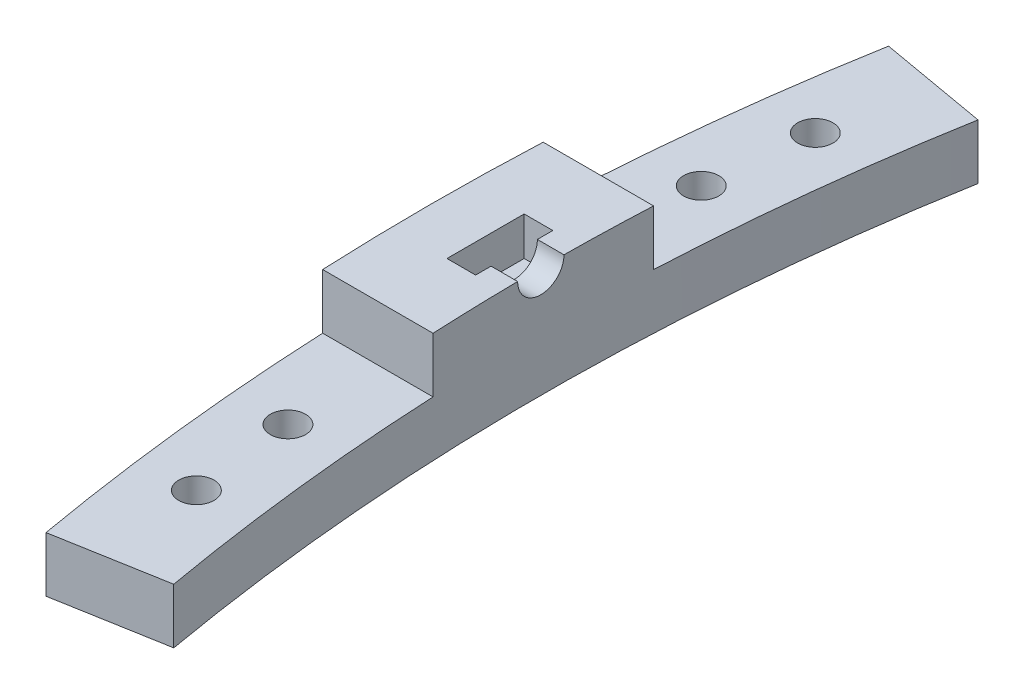
ISO-10303-21;
HEADER;
FILE_DESCRIPTION(('STEP AP214'),'2;1');
FILE_NAME('part.step','',(''),(''),'','','');
FILE_SCHEMA(('AUTOMOTIVE_DESIGN { 1 0 10303 214 1 1 1 1 }'));
ENDSEC;
DATA;
#1=APPLICATION_CONTEXT('core data for automotive mechanical design processes');
#2=APPLICATION_PROTOCOL_DEFINITION('international standard','automotive_design',2000,#1);
#3=PRODUCT_CONTEXT('',#1,'mechanical');
#4=PRODUCT('Part','Part','',(#3));
#5=PRODUCT_RELATED_PRODUCT_CATEGORY('part','',(#4));
#6=PRODUCT_DEFINITION_FORMATION('','',#4);
#7=PRODUCT_DEFINITION_CONTEXT('part definition',#1,'design');
#8=PRODUCT_DEFINITION('design','',#6,#7);
#9=PRODUCT_DEFINITION_SHAPE('','',#8);
#10=(LENGTH_UNIT() NAMED_UNIT(*) SI_UNIT(.MILLI.,.METRE.));
#11=(NAMED_UNIT(*) PLANE_ANGLE_UNIT() SI_UNIT($,.RADIAN.));
#12=(NAMED_UNIT(*) SI_UNIT($,.STERADIAN.) SOLID_ANGLE_UNIT());
#13=UNCERTAINTY_MEASURE_WITH_UNIT(LENGTH_MEASURE(1.E-05),#10,'distance_accuracy_value','');
#14=(GEOMETRIC_REPRESENTATION_CONTEXT(3) GLOBAL_UNCERTAINTY_ASSIGNED_CONTEXT((#13)) GLOBAL_UNIT_ASSIGNED_CONTEXT((#10,
#11,#12)) REPRESENTATION_CONTEXT('',''));
#15=CARTESIAN_POINT('',(0.,0.,0.));
#16=DIRECTION('',(0.,0.,1.));
#17=DIRECTION('',(1.,0.,0.));
#18=AXIS2_PLACEMENT_3D('',#15,#16,#17);
#19=CARTESIAN_POINT('',(0.,10.,0.));
#20=DIRECTION('',(0.,1.,0.));
#21=DIRECTION('',(0.,0.,1.));
#22=AXIS2_PLACEMENT_3D('',#19,#20,#21);
#23=PLANE('',#22);
#24=DIRECTION('',(-1.,0.,0.));
#25=VECTOR('',#24,1.);
#26=CARTESIAN_POINT('',(-206.809628132564,10.,-2.09999999999996));
#27=LINE('',#26,#25);
#28=CARTESIAN_POINT('',(-209.989499737487,10.,-2.09999999999996));
#29=VERTEX_POINT('',#28);
#30=CARTESIAN_POINT('',(-212.4,10.,-2.09999999999996));
#31=VERTEX_POINT('',#30);
#32=EDGE_CURVE('E48',#29,#31,#27,.T.);
#33=ORIENTED_EDGE('',*,*,#32,.F.);
#34=CARTESIAN_POINT('',(0.,10.,0.));
#35=DIRECTION('',(0.,-1.,0.));
#36=DIRECTION('',(0.,0.,1.));
#37=AXIS2_PLACEMENT_3D('',#34,#35,#36);
#38=CIRCLE('',#37,210.);
#39=CARTESIAN_POINT('',(-209.76176963403,10.,-10.0000000000001));
#40=VERTEX_POINT('',#39);
#41=EDGE_CURVE('E237',#29,#40,#38,.T.);
#42=ORIENTED_EDGE('',*,*,#41,.T.);
#43=DIRECTION('',(-1.,0.,0.));
#44=VECTOR('',#43,1.);
#45=CARTESIAN_POINT('',(-219.772609758359,10.,-9.99999999999996));
#46=LINE('',#45,#44);
#47=CARTESIAN_POINT('',(-219.772609758359,10.,-9.99999999999996));
#48=VERTEX_POINT('',#47);
#49=EDGE_CURVE('E226',#40,#48,#46,.T.);
#50=ORIENTED_EDGE('',*,*,#49,.T.);
#51=CARTESIAN_POINT('',(0.,10.,0.));
#52=DIRECTION('',(0.,1.,0.));
#53=DIRECTION('',(0.,0.,1.));
#54=AXIS2_PLACEMENT_3D('',#51,#52,#53);
#55=CIRCLE('',#54,220.);
#56=CARTESIAN_POINT('',(-219.772609758359,10.,10.));
#57=VERTEX_POINT('',#56);
#58=EDGE_CURVE('E230',#48,#57,#55,.T.);
#59=ORIENTED_EDGE('',*,*,#58,.T.);
#60=DIRECTION('',(1.,0.,0.));
#61=VECTOR('',#60,1.);
#62=CARTESIAN_POINT('',(-219.772609758359,10.,10.));
#63=LINE('',#62,#61);
#64=CARTESIAN_POINT('',(-209.76176963403,10.,10.));
#65=VERTEX_POINT('',#64);
#66=EDGE_CURVE('E238',#57,#65,#63,.T.);
#67=ORIENTED_EDGE('',*,*,#66,.T.);
#68=CARTESIAN_POINT('',(-209.989499737487,10.,2.10000000000004));
#69=VERTEX_POINT('',#68);
#70=EDGE_CURVE('E144',#65,#69,#38,.T.);
#71=ORIENTED_EDGE('',*,*,#70,.T.);
#72=DIRECTION('',(-1.,0.,0.));
#73=VECTOR('',#72,1.);
#74=CARTESIAN_POINT('',(-206.809628132564,10.,2.10000000000004));
#75=LINE('',#74,#73);
#76=CARTESIAN_POINT('',(-212.4,10.,2.10000000000004));
#77=VERTEX_POINT('',#76);
#78=EDGE_CURVE('E134',#77,#69,#75,.F.);
#79=ORIENTED_EDGE('',*,*,#78,.F.);
#80=DIRECTION('',(0.,0.,1.));
#81=VECTOR('',#80,1.);
#82=CARTESIAN_POINT('',(-212.4,10.,0.));
#83=LINE('',#82,#81);
#84=CARTESIAN_POINT('',(-212.4,10.,3.50000000000003));
#85=VERTEX_POINT('',#84);
#86=EDGE_CURVE('E41',#77,#85,#83,.T.);
#87=ORIENTED_EDGE('',*,*,#86,.T.);
#88=DIRECTION('',(1.,0.,0.));
#89=VECTOR('',#88,1.);
#90=CARTESIAN_POINT('',(0.,10.,3.5));
#91=LINE('',#90,#89);
#92=CARTESIAN_POINT('',(-215.,10.,3.50000000000003));
#93=VERTEX_POINT('',#92);
#94=EDGE_CURVE('E151',#93,#85,#91,.T.);
#95=ORIENTED_EDGE('',*,*,#94,.F.);
#96=DIRECTION('',(0.,0.,1.));
#97=VECTOR('',#96,1.);
#98=CARTESIAN_POINT('',(-215.,10.,0.));
#99=LINE('',#98,#97);
#100=CARTESIAN_POINT('',(-215.,10.,-3.49999999999997));
#101=VERTEX_POINT('',#100);
#102=EDGE_CURVE('E155',#101,#93,#99,.T.);
#103=ORIENTED_EDGE('',*,*,#102,.F.);
#104=DIRECTION('',(-1.,0.,0.));
#105=VECTOR('',#104,1.);
#106=CARTESIAN_POINT('',(0.,10.,-3.5));
#107=LINE('',#106,#105);
#108=CARTESIAN_POINT('',(-212.4,10.,-3.49999999999997));
#109=VERTEX_POINT('',#108);
#110=EDGE_CURVE('E152',#109,#101,#107,.T.);
#111=ORIENTED_EDGE('',*,*,#110,.F.);
#112=EDGE_CURVE('E11',#109,#31,#83,.T.);
#113=ORIENTED_EDGE('',*,*,#112,.T.);
#114=EDGE_LOOP('',(#33,#42,#50,#59,#67,#71,#79,#87,#95,#103,#111,#113));
#115=FACE_BOUND('',#114,.T.);
#116=ADVANCED_FACE('F33',(#115),#23,.T.);
#117=CARTESIAN_POINT('',(0.,5.,0.));
#118=DIRECTION('',(0.,1.,0.));
#119=DIRECTION('',(0.,0.,1.));
#120=AXIS2_PLACEMENT_3D('',#117,#118,#119);
#121=PLANE('',#120);
#122=DIRECTION('',(-1.,0.,0.));
#123=VECTOR('',#122,1.);
#124=CARTESIAN_POINT('',(-219.772609758359,5.,-9.99999999999996));
#125=LINE('',#124,#123);
#126=CARTESIAN_POINT('',(-209.76176963403,5.,-9.99999999999996));
#127=VERTEX_POINT('',#126);
#128=CARTESIAN_POINT('',(-219.772609758359,5.,-9.99999999999996));
#129=VERTEX_POINT('',#128);
#130=EDGE_CURVE('E227',#127,#129,#125,.T.);
#131=ORIENTED_EDGE('',*,*,#130,.F.);
#132=CARTESIAN_POINT('',(0.,5.,0.));
#133=DIRECTION('',(0.,-1.,0.));
#134=DIRECTION('',(0.,0.,1.));
#135=AXIS2_PLACEMENT_3D('',#132,#133,#134);
#136=CIRCLE('',#135,210.);
#137=CARTESIAN_POINT('',(-206.809628132564,5.,-36.4661173100554));
#138=VERTEX_POINT('',#137);
#139=EDGE_CURVE('E186',#127,#138,#136,.T.);
#140=ORIENTED_EDGE('',*,*,#139,.T.);
#141=DIRECTION('',(-0.984807753012208,0.,-0.173648177666932));
#142=VECTOR('',#141,1.);
#143=CARTESIAN_POINT('',(-216.657705662686,5.,-38.2025990867247));
#144=LINE('',#143,#142);
#145=CARTESIAN_POINT('',(-216.657705662686,5.,-38.2025990867247));
#146=VERTEX_POINT('',#145);
#147=EDGE_CURVE('E171',#138,#146,#144,.T.);
#148=ORIENTED_EDGE('',*,*,#147,.T.);
#149=CARTESIAN_POINT('',(0.,5.,0.));
#150=DIRECTION('',(0.,1.,0.));
#151=DIRECTION('',(0.,0.,1.));
#152=AXIS2_PLACEMENT_3D('',#149,#150,#151);
#153=CIRCLE('',#152,220.);
#154=EDGE_CURVE('E189',#146,#129,#153,.T.);
#155=ORIENTED_EDGE('',*,*,#154,.T.);
#156=EDGE_LOOP('',(#131,#140,#148,#155));
#157=FACE_BOUND('',#156,.T.);
#158=CARTESIAN_POINT('',(-213.160645195369,5.,-28.0631313273112));
#159=DIRECTION('',(0.,-1.,0.));
#160=DIRECTION('',(0.,0.,-1.));
#161=AXIS2_PLACEMENT_3D('',#158,#159,#160);
#162=CIRCLE('',#161,1.59999999999999);
#163=CARTESIAN_POINT('',(-213.160645195369,5.,-29.6631313273112));
#164=VERTEX_POINT('',#163);
#165=EDGE_CURVE('E182',#164,#164,#162,.T.);
#166=ORIENTED_EDGE('',*,*,#165,.T.);
#167=EDGE_LOOP('',(#166));
#168=FACE_BOUND('',#167,.T.);
#169=CARTESIAN_POINT('',(-214.181860089725,5.,-18.7384846907466));
#170=DIRECTION('',(0.,-1.,0.));
#171=DIRECTION('',(0.,0.,-1.));
#172=AXIS2_PLACEMENT_3D('',#169,#170,#171);
#173=CIRCLE('',#172,1.59999999999999);
#174=CARTESIAN_POINT('',(-214.181860089725,5.,-20.3384846907466));
#175=VERTEX_POINT('',#174);
#176=EDGE_CURVE('E202',#175,#175,#173,.T.);
#177=ORIENTED_EDGE('',*,*,#176,.T.);
#178=EDGE_LOOP('',(#177));
#179=FACE_BOUND('',#178,.T.);
#180=ADVANCED_FACE('F290',(#157,#168,#179),#121,.T.);
#181=CARTESIAN_POINT('',(0.,5.,0.));
#182=DIRECTION('',(0.,-1.,0.));
#183=DIRECTION('',(0.,0.,-1.));
#184=AXIS2_PLACEMENT_3D('',#181,#182,#183);
#185=CYLINDRICAL_SURFACE('',#184,220.);
#186=CARTESIAN_POINT('',(0.,0.,0.));
#187=DIRECTION('',(0.,1.,0.));
#188=DIRECTION('',(0.,0.,1.));
#189=AXIS2_PLACEMENT_3D('',#186,#187,#188);
#190=CIRCLE('',#189,220.);
#191=CARTESIAN_POINT('',(-216.657705662686,0.,-38.2025990867247));
#192=VERTEX_POINT('',#191);
#193=CARTESIAN_POINT('',(-216.657705662686,0.,38.2025990867248));
#194=VERTEX_POINT('',#193);
#195=EDGE_CURVE('E179',#192,#194,#190,.T.);
#196=ORIENTED_EDGE('',*,*,#195,.T.);
#197=DIRECTION('',(0.,-1.,0.));
#198=VECTOR('',#197,1.);
#199=CARTESIAN_POINT('',(-216.657705662686,5.,38.2025990867248));
#200=LINE('',#199,#198);
#201=CARTESIAN_POINT('',(-216.657705662686,5.,38.2025990867248));
#202=VERTEX_POINT('',#201);
#203=EDGE_CURVE('E159',#202,#194,#200,.T.);
#204=ORIENTED_EDGE('',*,*,#203,.F.);
#205=CARTESIAN_POINT('',(-219.772609758359,5.,10.));
#206=VERTEX_POINT('',#205);
#207=EDGE_CURVE('E174',#206,#202,#153,.T.);
#208=ORIENTED_EDGE('',*,*,#207,.F.);
#209=DIRECTION('',(0.,-1.,0.));
#210=VECTOR('',#209,1.);
#211=CARTESIAN_POINT('',(-219.772609758359,10.,10.));
#212=LINE('',#211,#210);
#213=EDGE_CURVE('E214',#57,#206,#212,.T.);
#214=ORIENTED_EDGE('',*,*,#213,.F.);
#215=ORIENTED_EDGE('',*,*,#58,.F.);
#216=DIRECTION('',(0.,-1.,0.));
#217=VECTOR('',#216,1.);
#218=CARTESIAN_POINT('',(-219.772609758359,10.,-9.99999999999996));
#219=LINE('',#218,#217);
#220=EDGE_CURVE('E223',#48,#129,#219,.T.);
#221=ORIENTED_EDGE('',*,*,#220,.T.);
#222=ORIENTED_EDGE('',*,*,#154,.F.);
#223=DIRECTION('',(0.,-1.,0.));
#224=VECTOR('',#223,1.);
#225=CARTESIAN_POINT('',(-216.657705662686,5.,-38.2025990867247));
#226=LINE('',#225,#224);
#227=EDGE_CURVE('E168',#146,#192,#226,.T.);
#228=ORIENTED_EDGE('',*,*,#227,.T.);
#229=EDGE_LOOP('',(#196,#204,#208,#214,#215,#221,#222,#228));
#230=FACE_BOUND('',#229,.T.);
#231=ADVANCED_FACE('F35',(#230),#185,.T.);
#232=CARTESIAN_POINT('',(-206.809628132564,5.,36.4661173100555));
#233=DIRECTION('',(-0.173648177666932,0.,-0.984807753012208));
#234=DIRECTION('',(-0.984807753012208,0.,0.173648177666932));
#235=AXIS2_PLACEMENT_3D('',#232,#233,#234);
#236=PLANE('',#235);
#237=DIRECTION('',(0.984807753012208,0.,-0.173648177666932));
#238=VECTOR('',#237,1.);
#239=CARTESIAN_POINT('',(-206.809628132564,0.,36.4661173100555));
#240=LINE('',#239,#238);
#241=CARTESIAN_POINT('',(-206.809628132564,0.,36.4661173100555));
#242=VERTEX_POINT('',#241);
#243=EDGE_CURVE('E177',#194,#242,#240,.T.);
#244=ORIENTED_EDGE('',*,*,#243,.T.);
#245=DIRECTION('',(0.,-1.,0.));
#246=VECTOR('',#245,1.);
#247=CARTESIAN_POINT('',(-206.809628132564,5.,36.4661173100555));
#248=LINE('',#247,#246);
#249=CARTESIAN_POINT('',(-206.809628132564,5.,36.4661173100555));
#250=VERTEX_POINT('',#249);
#251=EDGE_CURVE('E162',#250,#242,#248,.T.);
#252=ORIENTED_EDGE('',*,*,#251,.F.);
#253=DIRECTION('',(0.984807753012208,0.,-0.173648177666932));
#254=VECTOR('',#253,1.);
#255=CARTESIAN_POINT('',(-206.809628132564,5.,36.4661173100555));
#256=LINE('',#255,#254);
#257=EDGE_CURVE('E187',#202,#250,#256,.T.);
#258=ORIENTED_EDGE('',*,*,#257,.F.);
#259=ORIENTED_EDGE('',*,*,#203,.T.);
#260=EDGE_LOOP('',(#244,#252,#258,#259));
#261=FACE_BOUND('',#260,.T.);
#262=ADVANCED_FACE('F327',(#261),#236,.F.);
#263=CARTESIAN_POINT('',(0.,5.,0.));
#264=DIRECTION('',(0.,-1.,0.));
#265=DIRECTION('',(0.,0.,-1.));
#266=AXIS2_PLACEMENT_3D('',#263,#264,#265);
#267=CYLINDRICAL_SURFACE('',#266,210.);
#268=ORIENTED_EDGE('',*,*,#41,.F.);
#269=CARTESIAN_POINT('',(-209.989499737487,10.,-2.09999999999996));
#270=CARTESIAN_POINT('',(-209.989499597766,9.94092015096512,-2.09999960948762));
#271=CARTESIAN_POINT('',(-209.989524702156,9.88186860849199,-2.09750527312861));
#272=CARTESIAN_POINT('',(-209.989623918187,9.76418808889774,-2.08755436063873));
#273=CARTESIAN_POINT('',(-209.989698027474,9.70555909160296,-2.08009802301749));
#274=CARTESIAN_POINT('',(-209.989991332251,9.53103244758498,-2.05035585162594));
#275=CARTESIAN_POINT('',(-209.990281513918,9.41630395244865,-2.02069666960837));
#276=CARTESIAN_POINT('',(-209.991018969006,9.19346032461085,-1.94253996925181));
#277=CARTESIAN_POINT('',(-209.991466315148,9.08534828061854,-1.89403372916367));
#278=CARTESIAN_POINT('',(-209.992467499276,8.87880742239074,-1.77956641268683));
#279=CARTESIAN_POINT('',(-209.993021316412,8.78037671810774,-1.71360875258107));
#280=CARTESIAN_POINT('',(-209.994173115153,8.59598334859645,-1.56610365870984));
#281=CARTESIAN_POINT('',(-209.994771099105,8.51002134691426,-1.48455539579525));
#282=CARTESIAN_POINT('',(-209.99594388761,8.35299362675475,-1.3081717560387));
#283=CARTESIAN_POINT('',(-209.996518688619,8.28193017880743,-1.21333435761002));
#284=CARTESIAN_POINT('',(-209.997580192105,8.15673655531568,-1.01307651402876));
#285=CARTESIAN_POINT('',(-209.998066896623,8.10260598717645,-0.907656314317044));
#286=CARTESIAN_POINT('',(-209.998897320951,8.01281527467819,-0.689230665784695));
#287=CARTESIAN_POINT('',(-209.999241049938,7.97715394496542,-0.576225704279219));
#288=CARTESIAN_POINT('',(-209.999746813292,7.92530946125469,-0.345833872232214));
#289=CARTESIAN_POINT('',(-209.999908850098,7.90912604574585,-0.228447060543313));
#290=CARTESIAN_POINT('',(-210.000032970673,7.89669591185631,0.00738021844741409));
#291=CARTESIAN_POINT('',(-209.999995049892,7.90044964713363,0.125820709663871));
#292=CARTESIAN_POINT('',(-209.999723526459,7.92778763020722,0.360384787897445));
#293=CARTESIAN_POINT('',(-209.999489932749,7.95137097187669,0.476508480533969));
#294=CARTESIAN_POINT('',(-209.998853410172,8.01769727517462,0.703147911416878));
#295=CARTESIAN_POINT('',(-209.99845048182,8.06044017831221,0.813663666782186));
#296=CARTESIAN_POINT('',(-209.997520690855,8.16387428423152,1.02595551182042));
#297=CARTESIAN_POINT('',(-209.996993822741,8.22456628355769,1.12773121336879));
#298=CARTESIAN_POINT('',(-209.99587558645,8.36217214500734,1.31964400204868));
#299=CARTESIAN_POINT('',(-209.995284221428,8.43908521362181,1.40978165814732));
#300=CARTESIAN_POINT('',(-209.994103683743,8.606942382452,1.57585848036777));
#301=CARTESIAN_POINT('',(-209.993514510885,8.69788521260692,1.65179893033349));
#302=CARTESIAN_POINT('',(-209.992404534875,8.89126499965346,1.78735842282811));
#303=CARTESIAN_POINT('',(-209.991883753507,8.99370559948922,1.84697227175225));
#304=CARTESIAN_POINT('',(-209.990969222379,9.20718524046727,1.9481833572828));
#305=CARTESIAN_POINT('',(-209.990575550138,9.31822947765802,1.98976960480534));
#306=CARTESIAN_POINT('',(-209.989960663365,9.54563753003597,2.05364503265988));
#307=CARTESIAN_POINT('',(-209.989739185488,9.66199293292149,2.07596368555564));
#308=CARTESIAN_POINT('',(-209.98957715639,9.81593478447905,2.09224518309645));
#309=CARTESIAN_POINT('',(-209.989548139052,9.85272004154412,2.09515477508769));
#310=CARTESIAN_POINT('',(-209.989509455528,9.92633190016149,2.09902952859682));
#311=CARTESIAN_POINT('',(-209.989499757427,9.96315833280259,2.09999789697767));
#312=CARTESIAN_POINT('',(-209.989499737487,10.,2.10000000000004));
#313=B_SPLINE_CURVE_WITH_KNOTS('',3,(#269,#270,#271,#272,#273,#274,#275,#276,#277,#278,#279,
#280,#281,#282,#283,#284,#285,#286,#287,#288,#289,#290,#291,#292,#293,#294,#295,#296,#297,#298,
#299,#300,#301,#302,#303,#304,#305,#306,#307,#308,#309,#310,#311,#312),.UNSPECIFIED.,.F.,.F.,(4,
2,2,2,2,2,2,2,2,2,2,2,2,2,2,2,2,2,2,2,2,4),(0.,0.177130677336922,0.354252841109179,
0.707930880636361,1.06177278510635,1.41554547281172,1.76933698031205,2.12318236627932,
2.4770195476082,2.83083401688987,3.18464373579821,3.53846150547083,3.89226310808834,
4.24606363061758,4.5998798564526,4.95367877817156,5.30744569059737,5.66132500835812,
6.01541973801714,6.36897186412676,6.47963664391252,6.59011845651985),.UNSPECIFIED.);
#314=EDGE_CURVE('E253',#29,#69,#313,.T.);
#315=ORIENTED_EDGE('',*,*,#314,.T.);
#316=ORIENTED_EDGE('',*,*,#70,.F.);
#317=DIRECTION('',(0.,-1.,0.));
#318=VECTOR('',#317,1.);
#319=CARTESIAN_POINT('',(-209.76176963403,10.,10.));
#320=LINE('',#319,#318);
#321=CARTESIAN_POINT('',(-209.76176963403,5.,10.));
#322=VERTEX_POINT('',#321);
#323=EDGE_CURVE('E217',#65,#322,#320,.T.);
#324=ORIENTED_EDGE('',*,*,#323,.T.);
#325=EDGE_CURVE('E184',#250,#322,#136,.T.);
#326=ORIENTED_EDGE('',*,*,#325,.F.);
#327=ORIENTED_EDGE('',*,*,#251,.T.);
#328=CARTESIAN_POINT('',(0.,0.,0.));
#329=DIRECTION('',(0.,-1.,0.));
#330=DIRECTION('',(0.,0.,1.));
#331=AXIS2_PLACEMENT_3D('',#328,#329,#330);
#332=CIRCLE('',#331,210.);
#333=CARTESIAN_POINT('',(-206.809628132564,0.,-36.4661173100554));
#334=VERTEX_POINT('',#333);
#335=EDGE_CURVE('E175',#242,#334,#332,.T.);
#336=ORIENTED_EDGE('',*,*,#335,.T.);
#337=DIRECTION('',(0.,-1.,0.));
#338=VECTOR('',#337,1.);
#339=CARTESIAN_POINT('',(-206.809628132564,5.,-36.4661173100554));
#340=LINE('',#339,#338);
#341=EDGE_CURVE('E165',#138,#334,#340,.T.);
#342=ORIENTED_EDGE('',*,*,#341,.F.);
#343=ORIENTED_EDGE('',*,*,#139,.F.);
#344=DIRECTION('',(0.,-1.,0.));
#345=VECTOR('',#344,1.);
#346=CARTESIAN_POINT('',(-209.76176963403,10.,-10.0000000000001));
#347=LINE('',#346,#345);
#348=EDGE_CURVE('E220',#40,#127,#347,.T.);
#349=ORIENTED_EDGE('',*,*,#348,.F.);
#350=EDGE_LOOP('',(#268,#315,#316,#324,#326,#327,#336,#342,#343,#349));
#351=FACE_BOUND('',#350,.T.);
#352=ADVANCED_FACE('F265',(#351),#267,.F.);
#353=CARTESIAN_POINT('',(-216.657705662686,5.,-38.2025990867247));
#354=DIRECTION('',(-0.173648177666932,0.,0.984807753012208));
#355=DIRECTION('',(0.984807753012208,0.,0.173648177666932));
#356=AXIS2_PLACEMENT_3D('',#353,#354,#355);
#357=PLANE('',#356);
#358=DIRECTION('',(-0.984807753012208,0.,-0.173648177666932));
#359=VECTOR('',#358,1.);
#360=CARTESIAN_POINT('',(-216.657705662686,0.,-38.2025990867247));
#361=LINE('',#360,#359);
#362=EDGE_CURVE('E172',#334,#192,#361,.T.);
#363=ORIENTED_EDGE('',*,*,#362,.T.);
#364=ORIENTED_EDGE('',*,*,#227,.F.);
#365=ORIENTED_EDGE('',*,*,#147,.F.);
#366=ORIENTED_EDGE('',*,*,#341,.T.);
#367=EDGE_LOOP('',(#363,#364,#365,#366));
#368=FACE_BOUND('',#367,.T.);
#369=ADVANCED_FACE('F318',(#368),#357,.F.);
#370=DIRECTION('',(1.,0.,0.));
#371=VECTOR('',#370,1.);
#372=CARTESIAN_POINT('',(-219.772609758359,5.,10.));
#373=LINE('',#372,#371);
#374=EDGE_CURVE('E231',#206,#322,#373,.T.);
#375=ORIENTED_EDGE('',*,*,#374,.F.);
#376=ORIENTED_EDGE('',*,*,#207,.T.);
#377=ORIENTED_EDGE('',*,*,#257,.T.);
#378=ORIENTED_EDGE('',*,*,#325,.T.);
#379=EDGE_LOOP('',(#375,#376,#377,#378));
#380=FACE_BOUND('',#379,.T.);
#381=CARTESIAN_POINT('',(-214.181860089725,5.,18.7384846907465));
#382=DIRECTION('',(0.,-1.,0.));
#383=DIRECTION('',(0.,0.,-1.));
#384=AXIS2_PLACEMENT_3D('',#381,#382,#383);
#385=CIRCLE('',#384,1.59999999999999);
#386=CARTESIAN_POINT('',(-214.181860089725,5.,17.1384846907466));
#387=VERTEX_POINT('',#386);
#388=EDGE_CURVE('E208',#387,#387,#385,.T.);
#389=ORIENTED_EDGE('',*,*,#388,.T.);
#390=EDGE_LOOP('',(#389));
#391=FACE_BOUND('',#390,.T.);
#392=CARTESIAN_POINT('',(-213.160645195369,5.,28.0631313273111));
#393=DIRECTION('',(0.,-1.,0.));
#394=DIRECTION('',(0.,0.,-1.));
#395=AXIS2_PLACEMENT_3D('',#392,#393,#394);
#396=CIRCLE('',#395,1.59999999999999);
#397=CARTESIAN_POINT('',(-213.160645195369,5.,26.4631313273111));
#398=VERTEX_POINT('',#397);
#399=EDGE_CURVE('E196',#398,#398,#396,.T.);
#400=ORIENTED_EDGE('',*,*,#399,.T.);
#401=EDGE_LOOP('',(#400));
#402=FACE_BOUND('',#401,.T.);
#403=ADVANCED_FACE('F315',(#380,#391,#402),#121,.T.);
#404=CARTESIAN_POINT('',(0.,0.,0.));
#405=DIRECTION('',(0.,1.,0.));
#406=DIRECTION('',(0.,0.,1.));
#407=AXIS2_PLACEMENT_3D('',#404,#405,#406);
#408=PLANE('',#407);
#409=CARTESIAN_POINT('',(-214.181860089725,0.,18.7384846907465));
#410=DIRECTION('',(0.,-1.,0.));
#411=DIRECTION('',(0.,0.,-1.));
#412=AXIS2_PLACEMENT_3D('',#409,#410,#411);
#413=CIRCLE('',#412,1.59999999999999);
#414=CARTESIAN_POINT('',(-214.181860089725,0.,17.1384846907466));
#415=VERTEX_POINT('',#414);
#416=EDGE_CURVE('E211',#415,#415,#413,.T.);
#417=ORIENTED_EDGE('',*,*,#416,.F.);
#418=EDGE_LOOP('',(#417));
#419=FACE_BOUND('',#418,.T.);
#420=CARTESIAN_POINT('',(-214.181860089725,0.,-18.7384846907466));
#421=DIRECTION('',(0.,-1.,0.));
#422=DIRECTION('',(0.,0.,-1.));
#423=AXIS2_PLACEMENT_3D('',#420,#421,#422);
#424=CIRCLE('',#423,1.59999999999999);
#425=CARTESIAN_POINT('',(-214.181860089725,0.,-20.3384846907466));
#426=VERTEX_POINT('',#425);
#427=EDGE_CURVE('E205',#426,#426,#424,.T.);
#428=ORIENTED_EDGE('',*,*,#427,.F.);
#429=EDGE_LOOP('',(#428));
#430=FACE_BOUND('',#429,.T.);
#431=CARTESIAN_POINT('',(-213.160645195369,0.,28.0631313273111));
#432=DIRECTION('',(0.,-1.,0.));
#433=DIRECTION('',(0.,0.,-1.));
#434=AXIS2_PLACEMENT_3D('',#431,#432,#433);
#435=CIRCLE('',#434,1.59999999999999);
#436=CARTESIAN_POINT('',(-213.160645195369,0.,26.4631313273111));
#437=VERTEX_POINT('',#436);
#438=EDGE_CURVE('E199',#437,#437,#435,.T.);
#439=ORIENTED_EDGE('',*,*,#438,.F.);
#440=EDGE_LOOP('',(#439));
#441=FACE_BOUND('',#440,.T.);
#442=CARTESIAN_POINT('',(-213.160645195369,0.,-28.0631313273112));
#443=DIRECTION('',(0.,-1.,0.));
#444=DIRECTION('',(0.,0.,-1.));
#445=AXIS2_PLACEMENT_3D('',#442,#443,#444);
#446=CIRCLE('',#445,1.59999999999999);
#447=CARTESIAN_POINT('',(-213.160645195369,0.,-29.6631313273112));
#448=VERTEX_POINT('',#447);
#449=EDGE_CURVE('E193',#448,#448,#446,.T.);
#450=ORIENTED_EDGE('',*,*,#449,.F.);
#451=EDGE_LOOP('',(#450));
#452=FACE_BOUND('',#451,.T.);
#453=ORIENTED_EDGE('',*,*,#195,.F.);
#454=ORIENTED_EDGE('',*,*,#362,.F.);
#455=ORIENTED_EDGE('',*,*,#335,.F.);
#456=ORIENTED_EDGE('',*,*,#243,.F.);
#457=EDGE_LOOP('',(#453,#454,#455,#456));
#458=FACE_BOUND('',#457,.T.);
#459=ADVANCED_FACE('F313',(#419,#430,#441,#452,#458),#408,.F.);
#460=CARTESIAN_POINT('',(-213.160645195369,0.,-28.0631313273112));
#461=DIRECTION('',(0.,-1.,0.));
#462=DIRECTION('',(0.,0.,-1.));
#463=AXIS2_PLACEMENT_3D('',#460,#461,#462);
#464=CYLINDRICAL_SURFACE('',#463,1.59999999999999);
#465=ORIENTED_EDGE('',*,*,#165,.F.);
#466=EDGE_LOOP('',(#465));
#467=FACE_BOUND('',#466,.T.);
#468=ORIENTED_EDGE('',*,*,#449,.T.);
#469=EDGE_LOOP('',(#468));
#470=FACE_BOUND('',#469,.T.);
#471=ADVANCED_FACE('F309',(#467,#470),#464,.F.);
#472=CARTESIAN_POINT('',(-213.160645195369,0.,28.0631313273111));
#473=DIRECTION('',(0.,-1.,0.));
#474=DIRECTION('',(0.,0.,-1.));
#475=AXIS2_PLACEMENT_3D('',#472,#473,#474);
#476=CYLINDRICAL_SURFACE('',#475,1.59999999999999);
#477=ORIENTED_EDGE('',*,*,#399,.F.);
#478=EDGE_LOOP('',(#477));
#479=FACE_BOUND('',#478,.T.);
#480=ORIENTED_EDGE('',*,*,#438,.T.);
#481=EDGE_LOOP('',(#480));
#482=FACE_BOUND('',#481,.T.);
#483=ADVANCED_FACE('F305',(#479,#482),#476,.F.);
#484=CARTESIAN_POINT('',(-214.181860089725,0.,-18.7384846907466));
#485=DIRECTION('',(0.,-1.,0.));
#486=DIRECTION('',(0.,0.,-1.));
#487=AXIS2_PLACEMENT_3D('',#484,#485,#486);
#488=CYLINDRICAL_SURFACE('',#487,1.59999999999999);
#489=ORIENTED_EDGE('',*,*,#176,.F.);
#490=EDGE_LOOP('',(#489));
#491=FACE_BOUND('',#490,.T.);
#492=ORIENTED_EDGE('',*,*,#427,.T.);
#493=EDGE_LOOP('',(#492));
#494=FACE_BOUND('',#493,.T.);
#495=ADVANCED_FACE('F301',(#491,#494),#488,.F.);
#496=CARTESIAN_POINT('',(-214.181860089725,0.,18.7384846907465));
#497=DIRECTION('',(0.,-1.,0.));
#498=DIRECTION('',(0.,0.,-1.));
#499=AXIS2_PLACEMENT_3D('',#496,#497,#498);
#500=CYLINDRICAL_SURFACE('',#499,1.59999999999999);
#501=ORIENTED_EDGE('',*,*,#388,.F.);
#502=EDGE_LOOP('',(#501));
#503=FACE_BOUND('',#502,.T.);
#504=ORIENTED_EDGE('',*,*,#416,.T.);
#505=EDGE_LOOP('',(#504));
#506=FACE_BOUND('',#505,.T.);
#507=ADVANCED_FACE('F297',(#503,#506),#500,.F.);
#508=CARTESIAN_POINT('',(-219.772609758359,10.,10.));
#509=DIRECTION('',(0.,0.,-1.));
#510=DIRECTION('',(-1.,0.,0.));
#511=AXIS2_PLACEMENT_3D('',#508,#509,#510);
#512=PLANE('',#511);
#513=ORIENTED_EDGE('',*,*,#374,.T.);
#514=ORIENTED_EDGE('',*,*,#323,.F.);
#515=ORIENTED_EDGE('',*,*,#66,.F.);
#516=ORIENTED_EDGE('',*,*,#213,.T.);
#517=EDGE_LOOP('',(#513,#514,#515,#516));
#518=FACE_BOUND('',#517,.T.);
#519=ADVANCED_FACE('F293',(#518),#512,.F.);
#520=CARTESIAN_POINT('',(-219.772609758359,10.,-9.99999999999996));
#521=DIRECTION('',(0.,0.,1.));
#522=DIRECTION('',(1.,0.,0.));
#523=AXIS2_PLACEMENT_3D('',#520,#521,#522);
#524=PLANE('',#523);
#525=ORIENTED_EDGE('',*,*,#130,.T.);
#526=ORIENTED_EDGE('',*,*,#220,.F.);
#527=ORIENTED_EDGE('',*,*,#49,.F.);
#528=ORIENTED_EDGE('',*,*,#348,.T.);
#529=EDGE_LOOP('',(#525,#526,#527,#528));
#530=FACE_BOUND('',#529,.T.);
#531=ADVANCED_FACE('F287',(#530),#524,.F.);
#532=CARTESIAN_POINT('',(-212.4,13.5,3.50000000000003));
#533=DIRECTION('',(0.,0.,1.));
#534=DIRECTION('',(0.,-1.,0.));
#535=AXIS2_PLACEMENT_3D('',#532,#533,#534);
#536=PLANE('',#535);
#537=ORIENTED_EDGE('',*,*,#94,.T.);
#538=DIRECTION('',(0.,1.,0.));
#539=VECTOR('',#538,1.);
#540=CARTESIAN_POINT('',(-212.4,13.5,3.50000000000003));
#541=LINE('',#540,#539);
#542=CARTESIAN_POINT('',(-212.4,6.5,3.50000000000003));
#543=VERTEX_POINT('',#542);
#544=EDGE_CURVE('E150',#543,#85,#541,.T.);
#545=ORIENTED_EDGE('',*,*,#544,.F.);
#546=DIRECTION('',(-1.,0.,0.));
#547=VECTOR('',#546,1.);
#548=CARTESIAN_POINT('',(-212.4,6.5,3.50000000000003));
#549=LINE('',#548,#547);
#550=CARTESIAN_POINT('',(-215.,6.5,3.50000000000003));
#551=VERTEX_POINT('',#550);
#552=EDGE_CURVE('E234',#543,#551,#549,.T.);
#553=ORIENTED_EDGE('',*,*,#552,.T.);
#554=DIRECTION('',(0.,1.,0.));
#555=VECTOR('',#554,1.);
#556=CARTESIAN_POINT('',(-215.,13.5,3.50000000000003));
#557=LINE('',#556,#555);
#558=EDGE_CURVE('E251',#551,#93,#557,.T.);
#559=ORIENTED_EDGE('',*,*,#558,.T.);
#560=EDGE_LOOP('',(#537,#545,#553,#559));
#561=FACE_BOUND('',#560,.T.);
#562=ADVANCED_FACE('F280',(#561),#536,.F.);
#563=CARTESIAN_POINT('',(-212.4,6.5,-3.49999999999997));
#564=DIRECTION('',(0.,-1.,0.));
#565=DIRECTION('',(0.,0.,-1.));
#566=AXIS2_PLACEMENT_3D('',#563,#564,#565);
#567=PLANE('',#566);
#568=DIRECTION('',(0.,0.,1.));
#569=VECTOR('',#568,1.);
#570=CARTESIAN_POINT('',(-215.,6.5,-3.49999999999997));
#571=LINE('',#570,#569);
#572=CARTESIAN_POINT('',(-215.,6.5,-3.49999999999997));
#573=VERTEX_POINT('',#572);
#574=EDGE_CURVE('E247',#573,#551,#571,.T.);
#575=ORIENTED_EDGE('',*,*,#574,.T.);
#576=ORIENTED_EDGE('',*,*,#552,.F.);
#577=DIRECTION('',(0.,0.,1.));
#578=VECTOR('',#577,1.);
#579=CARTESIAN_POINT('',(-212.4,6.5,-3.49999999999997));
#580=LINE('',#579,#578);
#581=CARTESIAN_POINT('',(-212.4,6.5,-3.49999999999997));
#582=VERTEX_POINT('',#581);
#583=EDGE_CURVE('E245',#582,#543,#580,.T.);
#584=ORIENTED_EDGE('',*,*,#583,.F.);
#585=DIRECTION('',(-1.,0.,0.));
#586=VECTOR('',#585,1.);
#587=CARTESIAN_POINT('',(-212.4,6.5,-3.49999999999997));
#588=LINE('',#587,#586);
#589=EDGE_CURVE('E242',#582,#573,#588,.T.);
#590=ORIENTED_EDGE('',*,*,#589,.T.);
#591=EDGE_LOOP('',(#575,#576,#584,#590));
#592=FACE_BOUND('',#591,.T.);
#593=ADVANCED_FACE('F277',(#592),#567,.F.);
#594=CARTESIAN_POINT('',(-212.4,13.5,-3.49999999999997));
#595=DIRECTION('',(0.,0.,-1.));
#596=DIRECTION('',(0.,1.,0.));
#597=AXIS2_PLACEMENT_3D('',#594,#595,#596);
#598=PLANE('',#597);
#599=ORIENTED_EDGE('',*,*,#110,.T.);
#600=DIRECTION('',(0.,-1.,0.));
#601=VECTOR('',#600,1.);
#602=CARTESIAN_POINT('',(-215.,13.5,-3.49999999999997));
#603=LINE('',#602,#601);
#604=EDGE_CURVE('E56',#101,#573,#603,.T.);
#605=ORIENTED_EDGE('',*,*,#604,.T.);
#606=ORIENTED_EDGE('',*,*,#589,.F.);
#607=DIRECTION('',(0.,-1.,0.));
#608=VECTOR('',#607,1.);
#609=CARTESIAN_POINT('',(-212.4,13.5,-3.49999999999997));
#610=LINE('',#609,#608);
#611=EDGE_CURVE('E255',#109,#582,#610,.T.);
#612=ORIENTED_EDGE('',*,*,#611,.F.);
#613=EDGE_LOOP('',(#599,#605,#606,#612));
#614=FACE_BOUND('',#613,.T.);
#615=ADVANCED_FACE('F274',(#614),#598,.F.);
#616=CARTESIAN_POINT('',(-212.4,0.,0.));
#617=DIRECTION('',(-1.,0.,0.));
#618=DIRECTION('',(0.,0.,1.));
#619=AXIS2_PLACEMENT_3D('',#616,#617,#618);
#620=PLANE('',#619);
#621=CARTESIAN_POINT('',(-212.4,10.,0.));
#622=DIRECTION('',(-1.,0.,0.));
#623=DIRECTION('',(0.,0.,1.));
#624=AXIS2_PLACEMENT_3D('',#621,#622,#623);
#625=CIRCLE('',#624,2.1);
#626=EDGE_CURVE('E131',#31,#77,#625,.T.);
#627=ORIENTED_EDGE('',*,*,#626,.F.);
#628=ORIENTED_EDGE('',*,*,#112,.F.);
#629=ORIENTED_EDGE('',*,*,#611,.T.);
#630=ORIENTED_EDGE('',*,*,#583,.T.);
#631=ORIENTED_EDGE('',*,*,#544,.T.);
#632=ORIENTED_EDGE('',*,*,#86,.F.);
#633=EDGE_LOOP('',(#627,#628,#629,#630,#631,#632));
#634=FACE_BOUND('',#633,.T.);
#635=ADVANCED_FACE('F147',(#634),#620,.T.);
#636=CARTESIAN_POINT('',(-215.,0.,0.));
#637=DIRECTION('',(-1.,0.,0.));
#638=DIRECTION('',(0.,0.,1.));
#639=AXIS2_PLACEMENT_3D('',#636,#637,#638);
#640=PLANE('',#639);
#641=ORIENTED_EDGE('',*,*,#102,.T.);
#642=ORIENTED_EDGE('',*,*,#558,.F.);
#643=ORIENTED_EDGE('',*,*,#574,.F.);
#644=ORIENTED_EDGE('',*,*,#604,.F.);
#645=EDGE_LOOP('',(#641,#642,#643,#644));
#646=FACE_BOUND('',#645,.T.);
#647=ADVANCED_FACE('F271',(#646),#640,.F.);
#648=CARTESIAN_POINT('',(-206.809628132564,10.,0.));
#649=DIRECTION('',(-1.,0.,0.));
#650=DIRECTION('',(0.,0.,1.));
#651=AXIS2_PLACEMENT_3D('',#648,#649,#650);
#652=CYLINDRICAL_SURFACE('',#651,2.1);
#653=ORIENTED_EDGE('',*,*,#32,.T.);
#654=ORIENTED_EDGE('',*,*,#626,.T.);
#655=ORIENTED_EDGE('',*,*,#78,.T.);
#656=ORIENTED_EDGE('',*,*,#314,.F.);
#657=EDGE_LOOP('',(#653,#654,#655,#656));
#658=FACE_BOUND('',#657,.T.);
#659=ADVANCED_FACE('F133',(#658),#652,.F.);
#660=CLOSED_SHELL('',(#116,#180,#231,#262,#352,#369,#403,#459,#471,#483,#495,#507,#519,#531,
#562,#593,#615,#635,#647,#659));
#661=MANIFOLD_SOLID_BREP('B2',#660);
#662=ADVANCED_BREP_SHAPE_REPRESENTATION('',(#18,#661),#14);
#663=SHAPE_DEFINITION_REPRESENTATION(#9,#662);
ENDSEC;
END-ISO-10303-21;
